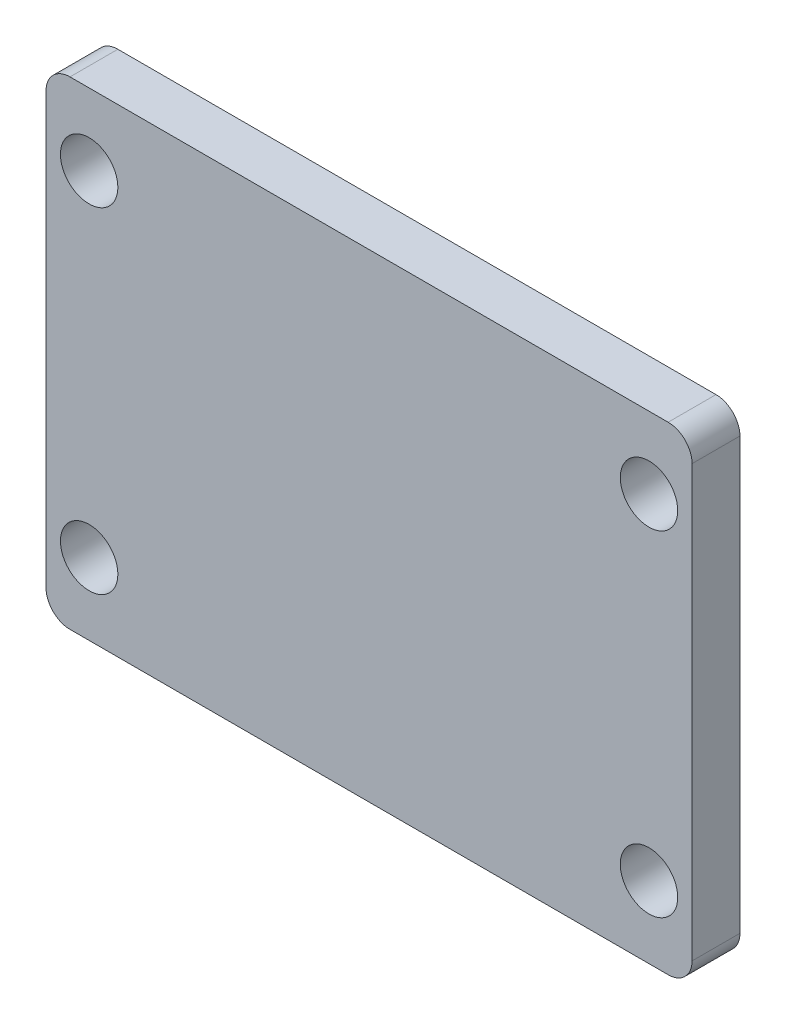
ISO-10303-21;
HEADER;
FILE_DESCRIPTION(('STEP AP214'),'2;1');
FILE_NAME('part.step','',(''),(''),'','','');
FILE_SCHEMA(('AUTOMOTIVE_DESIGN { 1 0 10303 214 1 1 1 1 }'));
ENDSEC;
DATA;
#1=APPLICATION_CONTEXT('core data for automotive mechanical design processes');
#2=APPLICATION_PROTOCOL_DEFINITION('international standard','automotive_design',2000,#1);
#3=PRODUCT_CONTEXT('',#1,'mechanical');
#4=PRODUCT('Part','Part','',(#3));
#5=PRODUCT_RELATED_PRODUCT_CATEGORY('part','',(#4));
#6=PRODUCT_DEFINITION_FORMATION('','',#4);
#7=PRODUCT_DEFINITION_CONTEXT('part definition',#1,'design');
#8=PRODUCT_DEFINITION('design','',#6,#7);
#9=PRODUCT_DEFINITION_SHAPE('','',#8);
#10=(LENGTH_UNIT() NAMED_UNIT(*) SI_UNIT(.MILLI.,.METRE.));
#11=(NAMED_UNIT(*) PLANE_ANGLE_UNIT() SI_UNIT($,.RADIAN.));
#12=(NAMED_UNIT(*) SI_UNIT($,.STERADIAN.) SOLID_ANGLE_UNIT());
#13=UNCERTAINTY_MEASURE_WITH_UNIT(LENGTH_MEASURE(1.E-05),#10,'distance_accuracy_value','');
#14=(GEOMETRIC_REPRESENTATION_CONTEXT(3) GLOBAL_UNCERTAINTY_ASSIGNED_CONTEXT((#13)) GLOBAL_UNIT_ASSIGNED_CONTEXT((#10,
#11,#12)) REPRESENTATION_CONTEXT('',''));
#15=CARTESIAN_POINT('',(0.,0.,0.));
#16=DIRECTION('',(0.,0.,1.));
#17=DIRECTION('',(1.,0.,0.));
#18=AXIS2_PLACEMENT_3D('',#15,#16,#17);
#19=CARTESIAN_POINT('',(62.5,-45.,10.));
#20=DIRECTION('',(0.,0.,-1.));
#21=DIRECTION('',(-1.,0.,0.));
#22=AXIS2_PLACEMENT_3D('',#19,#20,#21);
#23=PLANE('',#22);
#24=CARTESIAN_POINT('',(62.5,-45.,10.));
#25=DIRECTION('',(0.,0.,1.));
#26=DIRECTION('',(-1.,0.,0.));
#27=AXIS2_PLACEMENT_3D('',#24,#25,#26);
#28=CIRCLE('',#27,5.);
#29=CARTESIAN_POINT('',(62.5,-50.,10.));
#30=VERTEX_POINT('',#29);
#31=CARTESIAN_POINT('',(67.5,-45.,10.));
#32=VERTEX_POINT('',#31);
#33=EDGE_CURVE('E170',#30,#32,#28,.T.);
#34=ORIENTED_EDGE('',*,*,#33,.T.);
#35=DIRECTION('',(0.,1.,0.));
#36=VECTOR('',#35,1.);
#37=CARTESIAN_POINT('',(67.5,-45.,10.));
#38=LINE('',#37,#36);
#39=CARTESIAN_POINT('',(67.5,45.,10.));
#40=VERTEX_POINT('',#39);
#41=EDGE_CURVE('E106',#32,#40,#38,.T.);
#42=ORIENTED_EDGE('',*,*,#41,.T.);
#43=CARTESIAN_POINT('',(62.5,45.,10.));
#44=DIRECTION('',(0.,0.,1.));
#45=DIRECTION('',(1.,0.,0.));
#46=AXIS2_PLACEMENT_3D('',#43,#44,#45);
#47=CIRCLE('',#46,5.);
#48=CARTESIAN_POINT('',(62.5,50.,10.));
#49=VERTEX_POINT('',#48);
#50=EDGE_CURVE('E191',#40,#49,#47,.T.);
#51=ORIENTED_EDGE('',*,*,#50,.T.);
#52=DIRECTION('',(-1.,0.,0.));
#53=VECTOR('',#52,1.);
#54=CARTESIAN_POINT('',(62.5,50.,10.));
#55=LINE('',#54,#53);
#56=CARTESIAN_POINT('',(-62.5,50.,10.));
#57=VERTEX_POINT('',#56);
#58=EDGE_CURVE('E205',#49,#57,#55,.T.);
#59=ORIENTED_EDGE('',*,*,#58,.T.);
#60=CARTESIAN_POINT('',(-62.5,45.,10.));
#61=DIRECTION('',(0.,0.,1.));
#62=DIRECTION('',(-1.,0.,0.));
#63=AXIS2_PLACEMENT_3D('',#60,#61,#62);
#64=CIRCLE('',#63,5.);
#65=CARTESIAN_POINT('',(-67.5,45.,10.));
#66=VERTEX_POINT('',#65);
#67=EDGE_CURVE('E125',#57,#66,#64,.T.);
#68=ORIENTED_EDGE('',*,*,#67,.T.);
#69=DIRECTION('',(0.,-1.,0.));
#70=VECTOR('',#69,1.);
#71=CARTESIAN_POINT('',(-67.5,-45.,10.));
#72=LINE('',#71,#70);
#73=CARTESIAN_POINT('',(-67.5,-45.,10.));
#74=VERTEX_POINT('',#73);
#75=EDGE_CURVE('E119',#66,#74,#72,.T.);
#76=ORIENTED_EDGE('',*,*,#75,.T.);
#77=CARTESIAN_POINT('',(-62.5,-45.,10.));
#78=DIRECTION('',(0.,0.,1.));
#79=DIRECTION('',(-1.,0.,0.));
#80=AXIS2_PLACEMENT_3D('',#77,#78,#79);
#81=CIRCLE('',#80,5.);
#82=CARTESIAN_POINT('',(-62.5,-50.,10.));
#83=VERTEX_POINT('',#82);
#84=EDGE_CURVE('E123',#74,#83,#81,.T.);
#85=ORIENTED_EDGE('',*,*,#84,.T.);
#86=DIRECTION('',(1.,0.,0.));
#87=VECTOR('',#86,1.);
#88=CARTESIAN_POINT('',(62.5,-50.,10.));
#89=LINE('',#88,#87);
#90=EDGE_CURVE('E63',#83,#30,#89,.T.);
#91=ORIENTED_EDGE('',*,*,#90,.T.);
#92=EDGE_LOOP('',(#34,#42,#51,#59,#68,#76,#85,#91));
#93=FACE_BOUND('',#92,.T.);
#94=CARTESIAN_POINT('',(-58.5,-35.,10.));
#95=DIRECTION('',(0.,0.,1.));
#96=DIRECTION('',(1.,0.,0.));
#97=AXIS2_PLACEMENT_3D('',#94,#95,#96);
#98=CIRCLE('',#97,6.);
#99=CARTESIAN_POINT('',(-52.5,-35.,10.));
#100=VERTEX_POINT('',#99);
#101=EDGE_CURVE('E152',#100,#100,#98,.T.);
#102=ORIENTED_EDGE('',*,*,#101,.F.);
#103=EDGE_LOOP('',(#102));
#104=FACE_BOUND('',#103,.T.);
#105=CARTESIAN_POINT('',(-58.5,35.,10.));
#106=DIRECTION('',(0.,0.,1.));
#107=DIRECTION('',(1.,0.,0.));
#108=AXIS2_PLACEMENT_3D('',#105,#106,#107);
#109=CIRCLE('',#108,5.99999999999999);
#110=CARTESIAN_POINT('',(-52.5,35.,10.));
#111=VERTEX_POINT('',#110);
#112=EDGE_CURVE('E219',#111,#111,#109,.T.);
#113=ORIENTED_EDGE('',*,*,#112,.F.);
#114=EDGE_LOOP('',(#113));
#115=FACE_BOUND('',#114,.T.);
#116=CARTESIAN_POINT('',(58.5,35.0000000000012,10.));
#117=DIRECTION('',(0.,0.,1.));
#118=DIRECTION('',(1.,0.,0.));
#119=AXIS2_PLACEMENT_3D('',#116,#117,#118);
#120=CIRCLE('',#119,5.99999999999999);
#121=CARTESIAN_POINT('',(64.5,35.0000000000012,10.));
#122=VERTEX_POINT('',#121);
#123=EDGE_CURVE('E227',#122,#122,#120,.T.);
#124=ORIENTED_EDGE('',*,*,#123,.F.);
#125=EDGE_LOOP('',(#124));
#126=FACE_BOUND('',#125,.T.);
#127=CARTESIAN_POINT('',(58.5,-34.9999999999988,10.));
#128=DIRECTION('',(0.,0.,1.));
#129=DIRECTION('',(1.,0.,0.));
#130=AXIS2_PLACEMENT_3D('',#127,#128,#129);
#131=CIRCLE('',#130,5.99999999999999);
#132=CARTESIAN_POINT('',(64.5,-34.9999999999988,10.));
#133=VERTEX_POINT('',#132);
#134=EDGE_CURVE('E235',#133,#133,#131,.T.);
#135=ORIENTED_EDGE('',*,*,#134,.F.);
#136=EDGE_LOOP('',(#135));
#137=FACE_BOUND('',#136,.T.);
#138=ADVANCED_FACE('F45',(#93,#104,#115,#126,#137),#23,.F.);
#139=CARTESIAN_POINT('',(62.5,-45.,0.));
#140=DIRECTION('',(0.,0.,-1.));
#141=DIRECTION('',(-1.,0.,0.));
#142=AXIS2_PLACEMENT_3D('',#139,#140,#141);
#143=PLANE('',#142);
#144=CARTESIAN_POINT('',(58.5,35.0000000000012,0.));
#145=DIRECTION('',(0.,0.,1.));
#146=DIRECTION('',(1.,0.,0.));
#147=AXIS2_PLACEMENT_3D('',#144,#145,#146);
#148=CIRCLE('',#147,5.99999999999999);
#149=CARTESIAN_POINT('',(64.5,35.0000000000012,0.));
#150=VERTEX_POINT('',#149);
#151=EDGE_CURVE('E231',#150,#150,#148,.T.);
#152=ORIENTED_EDGE('',*,*,#151,.T.);
#153=EDGE_LOOP('',(#152));
#154=FACE_BOUND('',#153,.T.);
#155=CARTESIAN_POINT('',(-58.5,-35.,0.));
#156=DIRECTION('',(0.,0.,1.));
#157=DIRECTION('',(1.,0.,0.));
#158=AXIS2_PLACEMENT_3D('',#155,#156,#157);
#159=CIRCLE('',#158,6.);
#160=CARTESIAN_POINT('',(-52.5,-35.,0.));
#161=VERTEX_POINT('',#160);
#162=EDGE_CURVE('E215',#161,#161,#159,.T.);
#163=ORIENTED_EDGE('',*,*,#162,.T.);
#164=EDGE_LOOP('',(#163));
#165=FACE_BOUND('',#164,.T.);
#166=CARTESIAN_POINT('',(62.5,-45.,0.));
#167=DIRECTION('',(0.,0.,1.));
#168=DIRECTION('',(-1.,0.,0.));
#169=AXIS2_PLACEMENT_3D('',#166,#167,#168);
#170=CIRCLE('',#169,5.);
#171=CARTESIAN_POINT('',(62.5,-50.,0.));
#172=VERTEX_POINT('',#171);
#173=CARTESIAN_POINT('',(67.5,-45.,0.));
#174=VERTEX_POINT('',#173);
#175=EDGE_CURVE('E147',#172,#174,#170,.T.);
#176=ORIENTED_EDGE('',*,*,#175,.F.);
#177=DIRECTION('',(1.,0.,0.));
#178=VECTOR('',#177,1.);
#179=CARTESIAN_POINT('',(62.5,-50.,0.));
#180=LINE('',#179,#178);
#181=CARTESIAN_POINT('',(-62.5,-50.,0.));
#182=VERTEX_POINT('',#181);
#183=EDGE_CURVE('E98',#182,#172,#180,.T.);
#184=ORIENTED_EDGE('',*,*,#183,.F.);
#185=CARTESIAN_POINT('',(-62.5,-45.,0.));
#186=DIRECTION('',(0.,0.,1.));
#187=DIRECTION('',(-1.,0.,0.));
#188=AXIS2_PLACEMENT_3D('',#185,#186,#187);
#189=CIRCLE('',#188,5.);
#190=CARTESIAN_POINT('',(-67.5,-45.,0.));
#191=VERTEX_POINT('',#190);
#192=EDGE_CURVE('E92',#191,#182,#189,.T.);
#193=ORIENTED_EDGE('',*,*,#192,.F.);
#194=DIRECTION('',(0.,-1.,0.));
#195=VECTOR('',#194,1.);
#196=CARTESIAN_POINT('',(-67.5,-45.,0.));
#197=LINE('',#196,#195);
#198=CARTESIAN_POINT('',(-67.5,45.,0.));
#199=VERTEX_POINT('',#198);
#200=EDGE_CURVE('E134',#199,#191,#197,.T.);
#201=ORIENTED_EDGE('',*,*,#200,.F.);
#202=CARTESIAN_POINT('',(-62.5,45.,0.));
#203=DIRECTION('',(0.,0.,1.));
#204=DIRECTION('',(-1.,0.,0.));
#205=AXIS2_PLACEMENT_3D('',#202,#203,#204);
#206=CIRCLE('',#205,5.);
#207=CARTESIAN_POINT('',(-62.5,50.,0.));
#208=VERTEX_POINT('',#207);
#209=EDGE_CURVE('E161',#208,#199,#206,.T.);
#210=ORIENTED_EDGE('',*,*,#209,.F.);
#211=DIRECTION('',(-1.,0.,0.));
#212=VECTOR('',#211,1.);
#213=CARTESIAN_POINT('',(62.5,50.,0.));
#214=LINE('',#213,#212);
#215=CARTESIAN_POINT('',(62.5,50.,0.));
#216=VERTEX_POINT('',#215);
#217=EDGE_CURVE('E158',#216,#208,#214,.T.);
#218=ORIENTED_EDGE('',*,*,#217,.F.);
#219=CARTESIAN_POINT('',(62.5,45.,0.));
#220=DIRECTION('',(0.,0.,1.));
#221=DIRECTION('',(1.,0.,0.));
#222=AXIS2_PLACEMENT_3D('',#219,#220,#221);
#223=CIRCLE('',#222,5.);
#224=CARTESIAN_POINT('',(67.5,45.,0.));
#225=VERTEX_POINT('',#224);
#226=EDGE_CURVE('E155',#225,#216,#223,.T.);
#227=ORIENTED_EDGE('',*,*,#226,.F.);
#228=DIRECTION('',(0.,1.,0.));
#229=VECTOR('',#228,1.);
#230=CARTESIAN_POINT('',(67.5,-45.,0.));
#231=LINE('',#230,#229);
#232=EDGE_CURVE('E151',#174,#225,#231,.T.);
#233=ORIENTED_EDGE('',*,*,#232,.F.);
#234=EDGE_LOOP('',(#176,#184,#193,#201,#210,#218,#227,#233));
#235=FACE_BOUND('',#234,.T.);
#236=CARTESIAN_POINT('',(-58.5,35.,0.));
#237=DIRECTION('',(0.,0.,1.));
#238=DIRECTION('',(1.,0.,0.));
#239=AXIS2_PLACEMENT_3D('',#236,#237,#238);
#240=CIRCLE('',#239,5.99999999999999);
#241=CARTESIAN_POINT('',(-52.5,35.,0.));
#242=VERTEX_POINT('',#241);
#243=EDGE_CURVE('E223',#242,#242,#240,.T.);
#244=ORIENTED_EDGE('',*,*,#243,.T.);
#245=EDGE_LOOP('',(#244));
#246=FACE_BOUND('',#245,.T.);
#247=CARTESIAN_POINT('',(58.5,-34.9999999999988,0.));
#248=DIRECTION('',(0.,0.,1.));
#249=DIRECTION('',(1.,0.,0.));
#250=AXIS2_PLACEMENT_3D('',#247,#248,#249);
#251=CIRCLE('',#250,5.99999999999999);
#252=CARTESIAN_POINT('',(64.5,-34.9999999999988,0.));
#253=VERTEX_POINT('',#252);
#254=EDGE_CURVE('E239',#253,#253,#251,.T.);
#255=ORIENTED_EDGE('',*,*,#254,.T.);
#256=EDGE_LOOP('',(#255));
#257=FACE_BOUND('',#256,.T.);
#258=ADVANCED_FACE('F195',(#154,#165,#235,#246,#257),#143,.T.);
#259=CARTESIAN_POINT('',(62.5,-45.,10.));
#260=DIRECTION('',(0.,0.,-1.));
#261=DIRECTION('',(-1.,0.,0.));
#262=AXIS2_PLACEMENT_3D('',#259,#260,#261);
#263=CYLINDRICAL_SURFACE('',#262,5.);
#264=ORIENTED_EDGE('',*,*,#175,.T.);
#265=DIRECTION('',(0.,0.,-1.));
#266=VECTOR('',#265,1.);
#267=CARTESIAN_POINT('',(67.5,-45.,10.));
#268=LINE('',#267,#266);
#269=EDGE_CURVE('E11',#32,#174,#268,.T.);
#270=ORIENTED_EDGE('',*,*,#269,.F.);
#271=ORIENTED_EDGE('',*,*,#33,.F.);
#272=DIRECTION('',(0.,0.,-1.));
#273=VECTOR('',#272,1.);
#274=CARTESIAN_POINT('',(62.5,-50.,10.));
#275=LINE('',#274,#273);
#276=EDGE_CURVE('E143',#30,#172,#275,.T.);
#277=ORIENTED_EDGE('',*,*,#276,.T.);
#278=EDGE_LOOP('',(#264,#270,#271,#277));
#279=FACE_BOUND('',#278,.T.);
#280=ADVANCED_FACE('F47',(#279),#263,.T.);
#281=CARTESIAN_POINT('',(67.5,-45.,10.));
#282=DIRECTION('',(-1.,0.,0.));
#283=DIRECTION('',(0.,0.,1.));
#284=AXIS2_PLACEMENT_3D('',#281,#282,#283);
#285=PLANE('',#284);
#286=ORIENTED_EDGE('',*,*,#232,.T.);
#287=DIRECTION('',(0.,0.,-1.));
#288=VECTOR('',#287,1.);
#289=CARTESIAN_POINT('',(67.5,45.,10.));
#290=LINE('',#289,#288);
#291=EDGE_CURVE('E55',#40,#225,#290,.T.);
#292=ORIENTED_EDGE('',*,*,#291,.F.);
#293=ORIENTED_EDGE('',*,*,#41,.F.);
#294=ORIENTED_EDGE('',*,*,#269,.T.);
#295=EDGE_LOOP('',(#286,#292,#293,#294));
#296=FACE_BOUND('',#295,.T.);
#297=ADVANCED_FACE('F273',(#296),#285,.F.);
#298=CARTESIAN_POINT('',(62.5,45.,10.));
#299=DIRECTION('',(0.,0.,-1.));
#300=DIRECTION('',(-1.,0.,0.));
#301=AXIS2_PLACEMENT_3D('',#298,#299,#300);
#302=CYLINDRICAL_SURFACE('',#301,5.);
#303=ORIENTED_EDGE('',*,*,#226,.T.);
#304=DIRECTION('',(0.,0.,-1.));
#305=VECTOR('',#304,1.);
#306=CARTESIAN_POINT('',(62.5,50.,10.));
#307=LINE('',#306,#305);
#308=EDGE_CURVE('E181',#49,#216,#307,.T.);
#309=ORIENTED_EDGE('',*,*,#308,.F.);
#310=ORIENTED_EDGE('',*,*,#50,.F.);
#311=ORIENTED_EDGE('',*,*,#291,.T.);
#312=EDGE_LOOP('',(#303,#309,#310,#311));
#313=FACE_BOUND('',#312,.T.);
#314=ADVANCED_FACE('F189',(#313),#302,.T.);
#315=CARTESIAN_POINT('',(62.5,50.,10.));
#316=DIRECTION('',(0.,-1.,0.));
#317=DIRECTION('',(0.,0.,-1.));
#318=AXIS2_PLACEMENT_3D('',#315,#316,#317);
#319=PLANE('',#318);
#320=ORIENTED_EDGE('',*,*,#217,.T.);
#321=DIRECTION('',(0.,0.,-1.));
#322=VECTOR('',#321,1.);
#323=CARTESIAN_POINT('',(-62.5,50.,10.));
#324=LINE('',#323,#322);
#325=EDGE_CURVE('E177',#57,#208,#324,.T.);
#326=ORIENTED_EDGE('',*,*,#325,.F.);
#327=ORIENTED_EDGE('',*,*,#58,.F.);
#328=ORIENTED_EDGE('',*,*,#308,.T.);
#329=EDGE_LOOP('',(#320,#326,#327,#328));
#330=FACE_BOUND('',#329,.T.);
#331=ADVANCED_FACE('F200',(#330),#319,.F.);
#332=CARTESIAN_POINT('',(-62.5,45.,10.));
#333=DIRECTION('',(0.,0.,-1.));
#334=DIRECTION('',(-1.,0.,0.));
#335=AXIS2_PLACEMENT_3D('',#332,#333,#334);
#336=CYLINDRICAL_SURFACE('',#335,5.);
#337=ORIENTED_EDGE('',*,*,#209,.T.);
#338=DIRECTION('',(0.,0.,-1.));
#339=VECTOR('',#338,1.);
#340=CARTESIAN_POINT('',(-67.5,45.,10.));
#341=LINE('',#340,#339);
#342=EDGE_CURVE('E136',#66,#199,#341,.T.);
#343=ORIENTED_EDGE('',*,*,#342,.F.);
#344=ORIENTED_EDGE('',*,*,#67,.F.);
#345=ORIENTED_EDGE('',*,*,#325,.T.);
#346=EDGE_LOOP('',(#337,#343,#344,#345));
#347=FACE_BOUND('',#346,.T.);
#348=ADVANCED_FACE('F203',(#347),#336,.T.);
#349=CARTESIAN_POINT('',(-67.5,-45.,10.));
#350=DIRECTION('',(1.,0.,0.));
#351=DIRECTION('',(0.,0.,-1.));
#352=AXIS2_PLACEMENT_3D('',#349,#350,#351);
#353=PLANE('',#352);
#354=ORIENTED_EDGE('',*,*,#200,.T.);
#355=DIRECTION('',(0.,0.,-1.));
#356=VECTOR('',#355,1.);
#357=CARTESIAN_POINT('',(-67.5,-45.,10.));
#358=LINE('',#357,#356);
#359=EDGE_CURVE('E131',#74,#191,#358,.T.);
#360=ORIENTED_EDGE('',*,*,#359,.F.);
#361=ORIENTED_EDGE('',*,*,#75,.F.);
#362=ORIENTED_EDGE('',*,*,#342,.T.);
#363=EDGE_LOOP('',(#354,#360,#361,#362));
#364=FACE_BOUND('',#363,.T.);
#365=ADVANCED_FACE('F132',(#364),#353,.F.);
#366=CARTESIAN_POINT('',(-62.5,-45.,10.));
#367=DIRECTION('',(0.,0.,-1.));
#368=DIRECTION('',(-1.,0.,0.));
#369=AXIS2_PLACEMENT_3D('',#366,#367,#368);
#370=CYLINDRICAL_SURFACE('',#369,5.);
#371=ORIENTED_EDGE('',*,*,#192,.T.);
#372=DIRECTION('',(0.,0.,-1.));
#373=VECTOR('',#372,1.);
#374=CARTESIAN_POINT('',(-62.5,-50.,10.));
#375=LINE('',#374,#373);
#376=EDGE_CURVE('E137',#83,#182,#375,.T.);
#377=ORIENTED_EDGE('',*,*,#376,.F.);
#378=ORIENTED_EDGE('',*,*,#84,.F.);
#379=ORIENTED_EDGE('',*,*,#359,.T.);
#380=EDGE_LOOP('',(#371,#377,#378,#379));
#381=FACE_BOUND('',#380,.T.);
#382=ADVANCED_FACE('F139',(#381),#370,.T.);
#383=CARTESIAN_POINT('',(62.5,-50.,10.));
#384=DIRECTION('',(0.,1.,0.));
#385=DIRECTION('',(0.,0.,1.));
#386=AXIS2_PLACEMENT_3D('',#383,#384,#385);
#387=PLANE('',#386);
#388=ORIENTED_EDGE('',*,*,#183,.T.);
#389=ORIENTED_EDGE('',*,*,#276,.F.);
#390=ORIENTED_EDGE('',*,*,#90,.F.);
#391=ORIENTED_EDGE('',*,*,#376,.T.);
#392=EDGE_LOOP('',(#388,#389,#390,#391));
#393=FACE_BOUND('',#392,.T.);
#394=ADVANCED_FACE('F261',(#393),#387,.F.);
#395=CARTESIAN_POINT('',(-58.5,-35.,10.));
#396=DIRECTION('',(0.,0.,-1.));
#397=DIRECTION('',(-1.,0.,0.));
#398=AXIS2_PLACEMENT_3D('',#395,#396,#397);
#399=CYLINDRICAL_SURFACE('',#398,6.);
#400=ORIENTED_EDGE('',*,*,#101,.T.);
#401=EDGE_LOOP('',(#400));
#402=FACE_BOUND('',#401,.T.);
#403=ORIENTED_EDGE('',*,*,#162,.F.);
#404=EDGE_LOOP('',(#403));
#405=FACE_BOUND('',#404,.T.);
#406=ADVANCED_FACE('F258',(#402,#405),#399,.F.);
#407=CARTESIAN_POINT('',(-58.5,35.,10.));
#408=DIRECTION('',(0.,0.,-1.));
#409=DIRECTION('',(-1.,0.,0.));
#410=AXIS2_PLACEMENT_3D('',#407,#408,#409);
#411=CYLINDRICAL_SURFACE('',#410,5.99999999999999);
#412=ORIENTED_EDGE('',*,*,#112,.T.);
#413=EDGE_LOOP('',(#412));
#414=FACE_BOUND('',#413,.T.);
#415=ORIENTED_EDGE('',*,*,#243,.F.);
#416=EDGE_LOOP('',(#415));
#417=FACE_BOUND('',#416,.T.);
#418=ADVANCED_FACE('F336',(#414,#417),#411,.F.);
#419=CARTESIAN_POINT('',(58.5,35.0000000000012,10.));
#420=DIRECTION('',(0.,0.,-1.));
#421=DIRECTION('',(-1.,0.,0.));
#422=AXIS2_PLACEMENT_3D('',#419,#420,#421);
#423=CYLINDRICAL_SURFACE('',#422,5.99999999999999);
#424=ORIENTED_EDGE('',*,*,#123,.T.);
#425=EDGE_LOOP('',(#424));
#426=FACE_BOUND('',#425,.T.);
#427=ORIENTED_EDGE('',*,*,#151,.F.);
#428=EDGE_LOOP('',(#427));
#429=FACE_BOUND('',#428,.T.);
#430=ADVANCED_FACE('F344',(#426,#429),#423,.F.);
#431=CARTESIAN_POINT('',(58.5,-34.9999999999988,10.));
#432=DIRECTION('',(0.,0.,-1.));
#433=DIRECTION('',(-1.,0.,0.));
#434=AXIS2_PLACEMENT_3D('',#431,#432,#433);
#435=CYLINDRICAL_SURFACE('',#434,5.99999999999999);
#436=ORIENTED_EDGE('',*,*,#134,.T.);
#437=EDGE_LOOP('',(#436));
#438=FACE_BOUND('',#437,.T.);
#439=ORIENTED_EDGE('',*,*,#254,.F.);
#440=EDGE_LOOP('',(#439));
#441=FACE_BOUND('',#440,.T.);
#442=ADVANCED_FACE('F247',(#438,#441),#435,.F.);
#443=CLOSED_SHELL('',(#138,#258,#280,#297,#314,#331,#348,#365,#382,#394,#406,#418,#430,#442));
#444=MANIFOLD_SOLID_BREP('B2',#443);
#445=ADVANCED_BREP_SHAPE_REPRESENTATION('',(#18,#444),#14);
#446=SHAPE_DEFINITION_REPRESENTATION(#9,#445);
ENDSEC;
END-ISO-10303-21;
